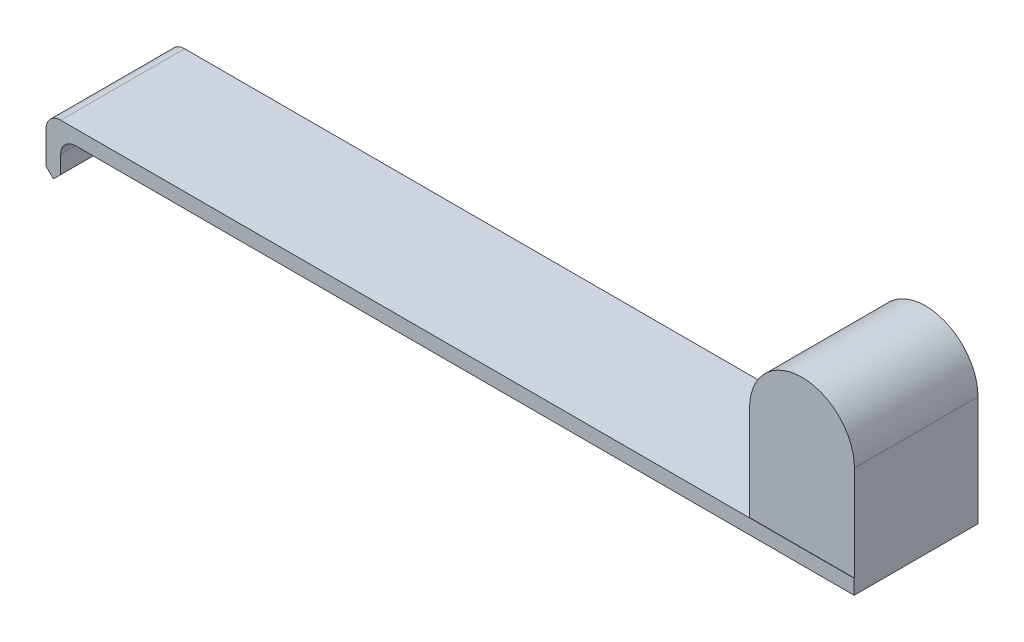
ISO-10303-21;
HEADER;
FILE_DESCRIPTION(('STEP AP214'),'2;1');
FILE_NAME('part.step','',(''),(''),'','','');
FILE_SCHEMA(('AUTOMOTIVE_DESIGN { 1 0 10303 214 1 1 1 1 }'));
ENDSEC;
DATA;
#1=APPLICATION_CONTEXT('core data for automotive mechanical design processes');
#2=APPLICATION_PROTOCOL_DEFINITION('international standard','automotive_design',2000,#1);
#3=PRODUCT_CONTEXT('',#1,'mechanical');
#4=PRODUCT('Part','Part','',(#3));
#5=PRODUCT_RELATED_PRODUCT_CATEGORY('part','',(#4));
#6=PRODUCT_DEFINITION_FORMATION('','',#4);
#7=PRODUCT_DEFINITION_CONTEXT('part definition',#1,'design');
#8=PRODUCT_DEFINITION('design','',#6,#7);
#9=PRODUCT_DEFINITION_SHAPE('','',#8);
#10=(LENGTH_UNIT() NAMED_UNIT(*) SI_UNIT(.MILLI.,.METRE.));
#11=(NAMED_UNIT(*) PLANE_ANGLE_UNIT() SI_UNIT($,.RADIAN.));
#12=(NAMED_UNIT(*) SI_UNIT($,.STERADIAN.) SOLID_ANGLE_UNIT());
#13=UNCERTAINTY_MEASURE_WITH_UNIT(LENGTH_MEASURE(1.E-05),#10,'distance_accuracy_value','');
#14=(GEOMETRIC_REPRESENTATION_CONTEXT(3) GLOBAL_UNCERTAINTY_ASSIGNED_CONTEXT((#13)) GLOBAL_UNIT_ASSIGNED_CONTEXT((#10,
#11,#12)) REPRESENTATION_CONTEXT('',''));
#15=CARTESIAN_POINT('',(0.,0.,0.));
#16=DIRECTION('',(0.,0.,1.));
#17=DIRECTION('',(1.,0.,0.));
#18=AXIS2_PLACEMENT_3D('',#15,#16,#17);
#19=CARTESIAN_POINT('',(-12.0999999999999,-1.09999999999992,2.659016994376));
#20=DIRECTION('',(-0.707106781186498,-0.707106781186598,0.));
#21=DIRECTION('',(0.707106781186598,-0.707106781186498,0.));
#22=AXIS2_PLACEMENT_3D('',#19,#20,#21);
#23=PLANE('',#22);
#24=DIRECTION('',(0.707106781186598,-0.707106781186498,0.));
#25=VECTOR('',#24,1.);
#26=CARTESIAN_POINT('',(-12.0999999999999,-1.09999999999992,2.09999999999998));
#27=LINE('',#26,#25);
#28=CARTESIAN_POINT('',(-11.8500000000005,-1.34999999999959,2.09999999999998));
#29=VERTEX_POINT('',#28);
#30=CARTESIAN_POINT('',(-12.0999999999998,-1.09999999999996,2.09999999999998));
#31=VERTEX_POINT('',#30);
#32=EDGE_CURVE('E105',#29,#31,#27,.F.);
#33=ORIENTED_EDGE('',*,*,#32,.T.);
#34=DIRECTION('',(0.,0.,1.));
#35=VECTOR('',#34,1.);
#36=CARTESIAN_POINT('',(-12.0999999999999,-1.09999999999992,-2.09999999999998));
#37=LINE('',#36,#35);
#38=CARTESIAN_POINT('',(-12.0999999999998,-1.09999999999996,-2.09999999999998));
#39=VERTEX_POINT('',#38);
#40=EDGE_CURVE('E107',#39,#31,#37,.T.);
#41=ORIENTED_EDGE('',*,*,#40,.F.);
#42=DIRECTION('',(0.707106781186598,-0.707106781186498,0.));
#43=VECTOR('',#42,1.);
#44=CARTESIAN_POINT('',(-12.0999999999999,-1.09999999999992,-2.09999999999998));
#45=LINE('',#44,#43);
#46=CARTESIAN_POINT('',(-11.8500000000005,-1.34999999999959,-2.09999999999998));
#47=VERTEX_POINT('',#46);
#48=EDGE_CURVE('E98',#39,#47,#45,.T.);
#49=ORIENTED_EDGE('',*,*,#48,.T.);
#50=DIRECTION('',(0.,0.,1.));
#51=VECTOR('',#50,1.);
#52=CARTESIAN_POINT('',(-11.8500000000006,-1.34999999999968,2.659016994376));
#53=LINE('',#52,#51);
#54=EDGE_CURVE('E124',#29,#47,#53,.F.);
#55=ORIENTED_EDGE('',*,*,#54,.F.);
#56=EDGE_LOOP('',(#33,#41,#49,#55));
#57=FACE_BOUND('',#56,.T.);
#58=ADVANCED_FACE('F16',(#57),#23,.T.);
#59=CARTESIAN_POINT('',(-12.0999999999999,-1.09999999999992,-2.09999999999998));
#60=DIRECTION('',(-1.,0.,0.));
#61=DIRECTION('',(0.,0.,1.));
#62=AXIS2_PLACEMENT_3D('',#59,#60,#61);
#63=PLANE('',#62);
#64=DIRECTION('',(0.,0.,1.));
#65=VECTOR('',#64,1.);
#66=CARTESIAN_POINT('',(-12.0999999999994,-4.85583223276586E-12,-2.09999999999998));
#67=LINE('',#66,#65);
#68=CARTESIAN_POINT('',(-12.0999999999996,-2.42791611638293E-12,-2.09999999999998));
#69=VERTEX_POINT('',#68);
#70=CARTESIAN_POINT('',(-12.0999999999996,-2.42791611638293E-12,2.09999999999998));
#71=VERTEX_POINT('',#70);
#72=EDGE_CURVE('E111',#69,#71,#67,.T.);
#73=ORIENTED_EDGE('',*,*,#72,.F.);
#74=DIRECTION('',(0.,1.,0.));
#75=VECTOR('',#74,1.);
#76=CARTESIAN_POINT('',(-12.0999999999999,-1.09999999999992,-2.09999999999998));
#77=LINE('',#76,#75);
#78=EDGE_CURVE('E102',#69,#39,#77,.F.);
#79=ORIENTED_EDGE('',*,*,#78,.T.);
#80=ORIENTED_EDGE('',*,*,#40,.T.);
#81=DIRECTION('',(0.,1.,0.));
#82=VECTOR('',#81,1.);
#83=CARTESIAN_POINT('',(-12.0999999999999,-1.09999999999992,2.09999999999998));
#84=LINE('',#83,#82);
#85=EDGE_CURVE('E75',#31,#71,#84,.T.);
#86=ORIENTED_EDGE('',*,*,#85,.T.);
#87=EDGE_LOOP('',(#73,#79,#80,#86));
#88=FACE_BOUND('',#87,.T.);
#89=ADVANCED_FACE('F109',(#88),#63,.T.);
#90=CARTESIAN_POINT('',(-11.8500000000009,-1.34999999999993,2.659016994376));
#91=DIRECTION('',(0.707106781186548,-0.707106781186548,0.));
#92=DIRECTION('',(0.707106781186548,0.707106781186548,0.));
#93=AXIS2_PLACEMENT_3D('',#90,#91,#92);
#94=PLANE('',#93);
#95=DIRECTION('',(0.707106781186548,0.707106781186548,0.));
#96=VECTOR('',#95,1.);
#97=CARTESIAN_POINT('',(-11.8500000000009,-1.34999999999993,2.09999999999998));
#98=LINE('',#97,#96);
#99=CARTESIAN_POINT('',(-11.5999999999994,-1.09999999999882,2.09999999999998));
#100=VERTEX_POINT('',#99);
#101=EDGE_CURVE('E114',#100,#29,#98,.F.);
#102=ORIENTED_EDGE('',*,*,#101,.T.);
#103=ORIENTED_EDGE('',*,*,#54,.T.);
#104=DIRECTION('',(0.707106781186548,0.707106781186548,0.));
#105=VECTOR('',#104,1.);
#106=CARTESIAN_POINT('',(-11.8500000000009,-1.34999999999993,-2.09999999999998));
#107=LINE('',#106,#105);
#108=CARTESIAN_POINT('',(-11.5999999999994,-1.09999999999882,-2.09999999999998));
#109=VERTEX_POINT('',#108);
#110=EDGE_CURVE('E83',#47,#109,#107,.T.);
#111=ORIENTED_EDGE('',*,*,#110,.T.);
#112=DIRECTION('',(0.,0.,-1.));
#113=VECTOR('',#112,1.);
#114=CARTESIAN_POINT('',(-11.5999999999993,-1.0999999999989,-2.09999999999998));
#115=LINE('',#114,#113);
#116=EDGE_CURVE('E150',#100,#109,#115,.T.);
#117=ORIENTED_EDGE('',*,*,#116,.F.);
#118=EDGE_LOOP('',(#102,#103,#111,#117));
#119=FACE_BOUND('',#118,.T.);
#120=ADVANCED_FACE('F162',(#119),#94,.T.);
#121=CARTESIAN_POINT('',(-11.5999999999993,0.,-2.09999999999998));
#122=DIRECTION('',(0.,0.,1.));
#123=DIRECTION('',(1.,0.,0.));
#124=AXIS2_PLACEMENT_3D('',#121,#122,#123);
#125=CYLINDRICAL_SURFACE('',#124,0.500000000000032);
#126=DIRECTION('',(0.,0.,1.));
#127=VECTOR('',#126,1.);
#128=CARTESIAN_POINT('',(-11.5999999999993,0.500000000000032,-2.09999999999998));
#129=LINE('',#128,#127);
#130=CARTESIAN_POINT('',(-11.5999999999993,0.500000000000032,-2.09999999999998));
#131=VERTEX_POINT('',#130);
#132=CARTESIAN_POINT('',(-11.5999999999993,0.500000000000032,2.09999999999998));
#133=VERTEX_POINT('',#132);
#134=EDGE_CURVE('E158',#131,#133,#129,.T.);
#135=ORIENTED_EDGE('',*,*,#134,.F.);
#136=CARTESIAN_POINT('',(-11.5999999999993,0.,-2.09999999999998));
#137=DIRECTION('',(0.,0.,1.));
#138=DIRECTION('',(1.,0.,0.));
#139=AXIS2_PLACEMENT_3D('',#136,#137,#138);
#140=CIRCLE('',#139,0.500000000000032);
#141=EDGE_CURVE('E149',#131,#69,#140,.T.);
#142=ORIENTED_EDGE('',*,*,#141,.T.);
#143=ORIENTED_EDGE('',*,*,#72,.T.);
#144=CARTESIAN_POINT('',(-11.5999999999993,0.,2.09999999999998));
#145=DIRECTION('',(0.,0.,1.));
#146=DIRECTION('',(1.,0.,0.));
#147=AXIS2_PLACEMENT_3D('',#144,#145,#146);
#148=CIRCLE('',#147,0.500000000000032);
#149=EDGE_CURVE('E19',#71,#133,#148,.F.);
#150=ORIENTED_EDGE('',*,*,#149,.T.);
#151=EDGE_LOOP('',(#135,#142,#143,#150));
#152=FACE_BOUND('',#151,.T.);
#153=ADVANCED_FACE('F157',(#152),#125,.T.);
#154=CARTESIAN_POINT('',(0.,0.,2.09100000000002));
#155=DIRECTION('',(0.,0.,-1.));
#156=DIRECTION('',(-1.,0.,0.));
#157=AXIS2_PLACEMENT_3D('',#154,#155,#156);
#158=PLANE('',#157);
#159=CARTESIAN_POINT('',(13.5332,3.7338,2.09100000000002));
#160=DIRECTION('',(0.,0.,-1.));
#161=DIRECTION('',(-1.,0.,0.));
#162=AXIS2_PLACEMENT_3D('',#159,#160,#161);
#163=CIRCLE('',#162,1.778);
#164=CARTESIAN_POINT('',(11.7552,3.7338,2.09100000000002));
#165=VERTEX_POINT('',#164);
#166=CARTESIAN_POINT('',(15.3112,3.7338,2.09100000000002));
#167=VERTEX_POINT('',#166);
#168=EDGE_CURVE('E145',#165,#167,#163,.T.);
#169=ORIENTED_EDGE('',*,*,#168,.F.);
#170=DIRECTION('',(0.,1.,0.));
#171=VECTOR('',#170,1.);
#172=CARTESIAN_POINT('',(11.7552,0.4318,2.09100000000002));
#173=LINE('',#172,#171);
#174=CARTESIAN_POINT('',(11.7552,0.500000000000032,2.09100000000002));
#175=VERTEX_POINT('',#174);
#176=EDGE_CURVE('E232',#175,#165,#173,.T.);
#177=ORIENTED_EDGE('',*,*,#176,.F.);
#178=DIRECTION('',(1.,0.,0.));
#179=VECTOR('',#178,1.);
#180=CARTESIAN_POINT('',(-11.5999999999993,0.500000000000032,2.09100000000002));
#181=LINE('',#180,#179);
#182=CARTESIAN_POINT('',(15.3112,0.500000000000032,2.09100000000002));
#183=VERTEX_POINT('',#182);
#184=EDGE_CURVE('E235',#183,#175,#181,.F.);
#185=ORIENTED_EDGE('',*,*,#184,.F.);
#186=DIRECTION('',(0.,1.,0.));
#187=VECTOR('',#186,1.);
#188=CARTESIAN_POINT('',(15.3112,0.,2.09100000000002));
#189=LINE('',#188,#187);
#190=EDGE_CURVE('E256',#167,#183,#189,.F.);
#191=ORIENTED_EDGE('',*,*,#190,.F.);
#192=EDGE_LOOP('',(#169,#177,#185,#191));
#193=FACE_BOUND('',#192,.T.);
#194=ADVANCED_FACE('F161',(#193),#158,.F.);
#195=CARTESIAN_POINT('',(-11.5999999999993,-0.500000000000032,-2.09999999999998));
#196=DIRECTION('',(1.,0.,0.));
#197=DIRECTION('',(0.,0.,-1.));
#198=AXIS2_PLACEMENT_3D('',#195,#196,#197);
#199=PLANE('',#198);
#200=ORIENTED_EDGE('',*,*,#116,.T.);
#201=DIRECTION('',(0.,1.,0.));
#202=VECTOR('',#201,1.);
#203=CARTESIAN_POINT('',(-11.5999999999993,-0.500000000000032,-2.09999999999998));
#204=LINE('',#203,#202);
#205=CARTESIAN_POINT('',(-11.5999999999991,-0.500000000004731,-2.09999999999998));
#206=VERTEX_POINT('',#205);
#207=EDGE_CURVE('E148',#109,#206,#204,.T.);
#208=ORIENTED_EDGE('',*,*,#207,.T.);
#209=DIRECTION('',(0.,0.,1.));
#210=VECTOR('',#209,1.);
#211=CARTESIAN_POINT('',(-11.5999999999988,-0.50000000000943,-2.09999999999998));
#212=LINE('',#211,#210);
#213=CARTESIAN_POINT('',(-11.5999999999991,-0.500000000004731,2.09999999999998));
#214=VERTEX_POINT('',#213);
#215=EDGE_CURVE('E144',#206,#214,#212,.T.);
#216=ORIENTED_EDGE('',*,*,#215,.T.);
#217=DIRECTION('',(0.,1.,0.));
#218=VECTOR('',#217,1.);
#219=CARTESIAN_POINT('',(-11.5999999999993,-0.500000000000032,2.09999999999998));
#220=LINE('',#219,#218);
#221=EDGE_CURVE('E213',#100,#214,#220,.T.);
#222=ORIENTED_EDGE('',*,*,#221,.F.);
#223=EDGE_LOOP('',(#200,#208,#216,#222));
#224=FACE_BOUND('',#223,.T.);
#225=ADVANCED_FACE('F169',(#224),#199,.T.);
#226=CARTESIAN_POINT('',(13.5332,3.7338,-2.09999999999998));
#227=DIRECTION('',(0.,0.,-1.));
#228=DIRECTION('',(-1.,0.,0.));
#229=AXIS2_PLACEMENT_3D('',#226,#227,#228);
#230=CYLINDRICAL_SURFACE('',#229,1.778);
#231=DIRECTION('',(0.,0.,1.));
#232=VECTOR('',#231,1.);
#233=CARTESIAN_POINT('',(11.7552,3.7338,-2.09999999999998));
#234=LINE('',#233,#232);
#235=CARTESIAN_POINT('',(11.7552,3.7338,-2.09999999999998));
#236=VERTEX_POINT('',#235);
#237=EDGE_CURVE('E147',#165,#236,#234,.F.);
#238=ORIENTED_EDGE('',*,*,#237,.F.);
#239=ORIENTED_EDGE('',*,*,#168,.T.);
#240=DIRECTION('',(0.,0.,-1.));
#241=VECTOR('',#240,1.);
#242=CARTESIAN_POINT('',(15.3112,3.7338,0.));
#243=LINE('',#242,#241);
#244=CARTESIAN_POINT('',(15.3112,3.7338,-2.09999999999998));
#245=VERTEX_POINT('',#244);
#246=EDGE_CURVE('E261',#245,#167,#243,.F.);
#247=ORIENTED_EDGE('',*,*,#246,.F.);
#248=CARTESIAN_POINT('',(13.5332,3.7338,-2.09999999999998));
#249=DIRECTION('',(0.,0.,-1.));
#250=DIRECTION('',(-1.,0.,0.));
#251=AXIS2_PLACEMENT_3D('',#248,#249,#250);
#252=CIRCLE('',#251,1.778);
#253=EDGE_CURVE('E138',#245,#236,#252,.F.);
#254=ORIENTED_EDGE('',*,*,#253,.T.);
#255=EDGE_LOOP('',(#238,#239,#247,#254));
#256=FACE_BOUND('',#255,.T.);
#257=ADVANCED_FACE('F201',(#256),#230,.T.);
#258=CARTESIAN_POINT('',(11.7552,0.4318,-2.09999999999998));
#259=DIRECTION('',(-1.,0.,0.));
#260=DIRECTION('',(0.,0.,1.));
#261=AXIS2_PLACEMENT_3D('',#258,#259,#260);
#262=PLANE('',#261);
#263=DIRECTION('',(0.,0.,1.));
#264=VECTOR('',#263,1.);
#265=CARTESIAN_POINT('',(11.7552,0.500000000000032,-2.09999999999998));
#266=LINE('',#265,#264);
#267=CARTESIAN_POINT('',(11.7552,0.500000000000032,-2.09999999999998));
#268=VERTEX_POINT('',#267);
#269=EDGE_CURVE('E240',#175,#268,#266,.F.);
#270=ORIENTED_EDGE('',*,*,#269,.F.);
#271=ORIENTED_EDGE('',*,*,#176,.T.);
#272=ORIENTED_EDGE('',*,*,#237,.T.);
#273=DIRECTION('',(0.,1.,0.));
#274=VECTOR('',#273,1.);
#275=CARTESIAN_POINT('',(11.7552,-0.500000000000032,-2.09999999999998));
#276=LINE('',#275,#274);
#277=EDGE_CURVE('E140',#236,#268,#276,.F.);
#278=ORIENTED_EDGE('',*,*,#277,.T.);
#279=EDGE_LOOP('',(#270,#271,#272,#278));
#280=FACE_BOUND('',#279,.T.);
#281=ADVANCED_FACE('F197',(#280),#262,.T.);
#282=CARTESIAN_POINT('',(-11.5999999999993,0.500000000000032,-2.09999999999998));
#283=DIRECTION('',(0.,1.,0.));
#284=DIRECTION('',(0.,0.,1.));
#285=AXIS2_PLACEMENT_3D('',#282,#283,#284);
#286=PLANE('',#285);
#287=DIRECTION('',(1.,0.,0.));
#288=VECTOR('',#287,1.);
#289=CARTESIAN_POINT('',(-11.0999999999988,0.500000000000032,2.09999999999998));
#290=LINE('',#289,#288);
#291=CARTESIAN_POINT('',(15.3112,0.500000000000032,2.09999999999998));
#292=VERTEX_POINT('',#291);
#293=EDGE_CURVE('E279',#292,#133,#290,.F.);
#294=ORIENTED_EDGE('',*,*,#293,.F.);
#295=DIRECTION('',(0.,0.,-1.));
#296=VECTOR('',#295,1.);
#297=CARTESIAN_POINT('',(15.3112,0.500000000000032,0.));
#298=LINE('',#297,#296);
#299=EDGE_CURVE('E222',#183,#292,#298,.F.);
#300=ORIENTED_EDGE('',*,*,#299,.F.);
#301=ORIENTED_EDGE('',*,*,#184,.T.);
#302=ORIENTED_EDGE('',*,*,#269,.T.);
#303=DIRECTION('',(1.,0.,0.));
#304=VECTOR('',#303,1.);
#305=CARTESIAN_POINT('',(-11.0999999999988,0.500000000000032,-2.09999999999998));
#306=LINE('',#305,#304);
#307=EDGE_CURVE('E137',#268,#131,#306,.F.);
#308=ORIENTED_EDGE('',*,*,#307,.T.);
#309=ORIENTED_EDGE('',*,*,#134,.T.);
#310=EDGE_LOOP('',(#294,#300,#301,#302,#308,#309));
#311=FACE_BOUND('',#310,.T.);
#312=ADVANCED_FACE('F193',(#311),#286,.T.);
#313=CARTESIAN_POINT('',(15.3112,0.,0.));
#314=DIRECTION('',(1.,0.,0.));
#315=DIRECTION('',(0.,0.,-1.));
#316=AXIS2_PLACEMENT_3D('',#313,#314,#315);
#317=PLANE('',#316);
#318=DIRECTION('',(0.,1.,0.));
#319=VECTOR('',#318,1.);
#320=CARTESIAN_POINT('',(15.3112,-0.500000000000032,-2.09999999999998));
#321=LINE('',#320,#319);
#322=CARTESIAN_POINT('',(15.3112,0.,-2.09999999999998));
#323=VERTEX_POINT('',#322);
#324=EDGE_CURVE('E141',#323,#245,#321,.T.);
#325=ORIENTED_EDGE('',*,*,#324,.T.);
#326=ORIENTED_EDGE('',*,*,#246,.T.);
#327=ORIENTED_EDGE('',*,*,#190,.T.);
#328=ORIENTED_EDGE('',*,*,#299,.T.);
#329=DIRECTION('',(0.,1.,0.));
#330=VECTOR('',#329,1.);
#331=CARTESIAN_POINT('',(15.3112,-0.500000000000032,2.09999999999998));
#332=LINE('',#331,#330);
#333=CARTESIAN_POINT('',(15.3112,0.,2.09999999999998));
#334=VERTEX_POINT('',#333);
#335=EDGE_CURVE('E269',#334,#292,#332,.T.);
#336=ORIENTED_EDGE('',*,*,#335,.F.);
#337=DIRECTION('',(0.,0.,-1.));
#338=VECTOR('',#337,1.);
#339=CARTESIAN_POINT('',(15.3112,0.,-2.09999999999998));
#340=LINE('',#339,#338);
#341=EDGE_CURVE('E136',#323,#334,#340,.F.);
#342=ORIENTED_EDGE('',*,*,#341,.F.);
#343=EDGE_LOOP('',(#325,#326,#327,#328,#336,#342));
#344=FACE_BOUND('',#343,.T.);
#345=ADVANCED_FACE('F189',(#344),#317,.T.);
#346=CARTESIAN_POINT('',(-11.0999999999988,-0.500000000000032,2.09999999999998));
#347=DIRECTION('',(0.,0.,1.));
#348=DIRECTION('',(1.,0.,0.));
#349=AXIS2_PLACEMENT_3D('',#346,#347,#348);
#350=PLANE('',#349);
#351=CARTESIAN_POINT('',(-11.0999999999988,-0.500000000000032,2.09999999999998));
#352=DIRECTION('',(0.,0.,1.));
#353=DIRECTION('',(1.,0.,0.));
#354=AXIS2_PLACEMENT_3D('',#351,#352,#353);
#355=CIRCLE('',#354,0.500000000000032);
#356=CARTESIAN_POINT('',(-11.0999999999988,0.,2.09999999999998));
#357=VERTEX_POINT('',#356);
#358=EDGE_CURVE('E142',#214,#357,#355,.F.);
#359=ORIENTED_EDGE('',*,*,#358,.T.);
#360=DIRECTION('',(1.,0.,0.));
#361=VECTOR('',#360,1.);
#362=CARTESIAN_POINT('',(1.90000000000002,0.,2.09999999999998));
#363=LINE('',#362,#361);
#364=EDGE_CURVE('E289',#334,#357,#363,.F.);
#365=ORIENTED_EDGE('',*,*,#364,.F.);
#366=ORIENTED_EDGE('',*,*,#335,.T.);
#367=ORIENTED_EDGE('',*,*,#293,.T.);
#368=ORIENTED_EDGE('',*,*,#149,.F.);
#369=ORIENTED_EDGE('',*,*,#85,.F.);
#370=ORIENTED_EDGE('',*,*,#32,.F.);
#371=ORIENTED_EDGE('',*,*,#101,.F.);
#372=ORIENTED_EDGE('',*,*,#221,.T.);
#373=EDGE_LOOP('',(#359,#365,#366,#367,#368,#369,#370,#371,#372));
#374=FACE_BOUND('',#373,.T.);
#375=ADVANCED_FACE('F186',(#374),#350,.T.);
#376=CARTESIAN_POINT('',(-11.0999999999988,-0.500000000000032,-2.09999999999998));
#377=DIRECTION('',(0.,0.,1.));
#378=DIRECTION('',(1.,0.,0.));
#379=AXIS2_PLACEMENT_3D('',#376,#377,#378);
#380=CYLINDRICAL_SURFACE('',#379,0.500000000000032);
#381=DIRECTION('',(0.,0.,-1.));
#382=VECTOR('',#381,1.);
#383=CARTESIAN_POINT('',(-11.0999999999988,0.,-2.09999999999998));
#384=LINE('',#383,#382);
#385=CARTESIAN_POINT('',(-11.0999999999988,0.,-2.09999999999998));
#386=VERTEX_POINT('',#385);
#387=EDGE_CURVE('E25',#357,#386,#384,.T.);
#388=ORIENTED_EDGE('',*,*,#387,.F.);
#389=ORIENTED_EDGE('',*,*,#358,.F.);
#390=ORIENTED_EDGE('',*,*,#215,.F.);
#391=CARTESIAN_POINT('',(-11.0999999999988,-0.500000000000032,-2.09999999999998));
#392=DIRECTION('',(0.,0.,1.));
#393=DIRECTION('',(1.,0.,0.));
#394=AXIS2_PLACEMENT_3D('',#391,#392,#393);
#395=CIRCLE('',#394,0.500000000000032);
#396=EDGE_CURVE('E34',#206,#386,#395,.F.);
#397=ORIENTED_EDGE('',*,*,#396,.T.);
#398=EDGE_LOOP('',(#388,#389,#390,#397));
#399=FACE_BOUND('',#398,.T.);
#400=ADVANCED_FACE('F180',(#399),#380,.F.);
#401=CARTESIAN_POINT('',(-11.0999999999988,-0.500000000000032,-2.09999999999998));
#402=DIRECTION('',(0.,0.,1.));
#403=DIRECTION('',(1.,0.,0.));
#404=AXIS2_PLACEMENT_3D('',#401,#402,#403);
#405=PLANE('',#404);
#406=ORIENTED_EDGE('',*,*,#207,.F.);
#407=ORIENTED_EDGE('',*,*,#110,.F.);
#408=ORIENTED_EDGE('',*,*,#48,.F.);
#409=ORIENTED_EDGE('',*,*,#78,.F.);
#410=ORIENTED_EDGE('',*,*,#141,.F.);
#411=ORIENTED_EDGE('',*,*,#307,.F.);
#412=ORIENTED_EDGE('',*,*,#277,.F.);
#413=ORIENTED_EDGE('',*,*,#253,.F.);
#414=ORIENTED_EDGE('',*,*,#324,.F.);
#415=DIRECTION('',(1.,0.,0.));
#416=VECTOR('',#415,1.);
#417=CARTESIAN_POINT('',(1.90000000000002,0.,-2.09999999999998));
#418=LINE('',#417,#416);
#419=EDGE_CURVE('E11',#386,#323,#418,.T.);
#420=ORIENTED_EDGE('',*,*,#419,.F.);
#421=ORIENTED_EDGE('',*,*,#396,.F.);
#422=EDGE_LOOP('',(#406,#407,#408,#409,#410,#411,#412,#413,#414,#420,#421));
#423=FACE_BOUND('',#422,.T.);
#424=ADVANCED_FACE('F100',(#423),#405,.F.);
#425=CARTESIAN_POINT('',(1.90000000000002,0.,-2.09999999999998));
#426=DIRECTION('',(0.,-1.,0.));
#427=DIRECTION('',(0.,0.,-1.));
#428=AXIS2_PLACEMENT_3D('',#425,#426,#427);
#429=PLANE('',#428);
#430=ORIENTED_EDGE('',*,*,#387,.T.);
#431=ORIENTED_EDGE('',*,*,#419,.T.);
#432=ORIENTED_EDGE('',*,*,#341,.T.);
#433=ORIENTED_EDGE('',*,*,#364,.T.);
#434=EDGE_LOOP('',(#430,#431,#432,#433));
#435=FACE_BOUND('',#434,.T.);
#436=ADVANCED_FACE('F173',(#435),#429,.T.);
#437=CLOSED_SHELL('',(#58,#89,#120,#153,#194,#225,#257,#281,#312,#345,#375,#400,#424,#436));
#438=MANIFOLD_SOLID_BREP('B1',#437);
#439=ADVANCED_BREP_SHAPE_REPRESENTATION('',(#18,#438),#14);
#440=SHAPE_DEFINITION_REPRESENTATION(#9,#439);
ENDSEC;
END-ISO-10303-21;
